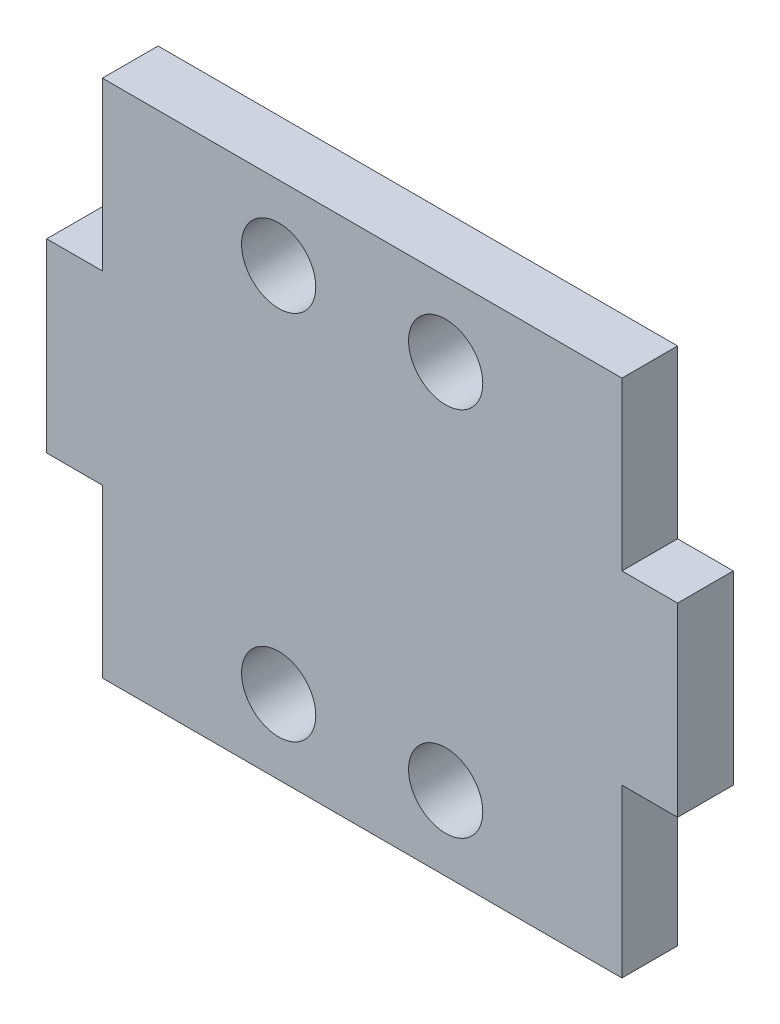
ISO-10303-21;
HEADER;
FILE_DESCRIPTION(('STEP AP214'),'2;1');
FILE_NAME('part.step','',(''),(''),'','','');
FILE_SCHEMA(('AUTOMOTIVE_DESIGN { 1 0 10303 214 1 1 1 1 }'));
ENDSEC;
DATA;
#1=APPLICATION_CONTEXT('core data for automotive mechanical design processes');
#2=APPLICATION_PROTOCOL_DEFINITION('international standard','automotive_design',2000,#1);
#3=PRODUCT_CONTEXT('',#1,'mechanical');
#4=PRODUCT('Part','Part','',(#3));
#5=PRODUCT_RELATED_PRODUCT_CATEGORY('part','',(#4));
#6=PRODUCT_DEFINITION_FORMATION('','',#4);
#7=PRODUCT_DEFINITION_CONTEXT('part definition',#1,'design');
#8=PRODUCT_DEFINITION('design','',#6,#7);
#9=PRODUCT_DEFINITION_SHAPE('','',#8);
#10=(LENGTH_UNIT() NAMED_UNIT(*) SI_UNIT(.MILLI.,.METRE.));
#11=(NAMED_UNIT(*) PLANE_ANGLE_UNIT() SI_UNIT($,.RADIAN.));
#12=(NAMED_UNIT(*) SI_UNIT($,.STERADIAN.) SOLID_ANGLE_UNIT());
#13=UNCERTAINTY_MEASURE_WITH_UNIT(LENGTH_MEASURE(1.E-05),#10,'distance_accuracy_value','');
#14=(GEOMETRIC_REPRESENTATION_CONTEXT(3) GLOBAL_UNCERTAINTY_ASSIGNED_CONTEXT((#13)) GLOBAL_UNIT_ASSIGNED_CONTEXT((#10,
#11,#12)) REPRESENTATION_CONTEXT('',''));
#15=CARTESIAN_POINT('',(0.,0.,0.));
#16=DIRECTION('',(0.,0.,1.));
#17=DIRECTION('',(1.,0.,0.));
#18=AXIS2_PLACEMENT_3D('',#15,#16,#17);
#19=CARTESIAN_POINT('',(0.,0.,3.));
#20=DIRECTION('',(0.,0.,-1.));
#21=DIRECTION('',(-1.,0.,0.));
#22=AXIS2_PLACEMENT_3D('',#19,#20,#21);
#23=PLANE('',#22);
#24=DIRECTION('',(0.,1.,0.));
#25=VECTOR('',#24,1.);
#26=CARTESIAN_POINT('',(-14.,5.,3.));
#27=LINE('',#26,#25);
#28=CARTESIAN_POINT('',(-14.,5.,3.));
#29=VERTEX_POINT('',#28);
#30=CARTESIAN_POINT('',(-14.,14.,3.));
#31=VERTEX_POINT('',#30);
#32=EDGE_CURVE('E342',#29,#31,#27,.T.);
#33=ORIENTED_EDGE('',*,*,#32,.F.);
#34=DIRECTION('',(-1.,0.,0.));
#35=VECTOR('',#34,1.);
#36=CARTESIAN_POINT('',(-14.,5.,3.));
#37=LINE('',#36,#35);
#38=CARTESIAN_POINT('',(-17.,5.,3.));
#39=VERTEX_POINT('',#38);
#40=EDGE_CURVE('E290',#29,#39,#37,.T.);
#41=ORIENTED_EDGE('',*,*,#40,.T.);
#42=DIRECTION('',(0.,-1.,0.));
#43=VECTOR('',#42,1.);
#44=CARTESIAN_POINT('',(-17.,5.,3.));
#45=LINE('',#44,#43);
#46=CARTESIAN_POINT('',(-17.,-5.,3.));
#47=VERTEX_POINT('',#46);
#48=EDGE_CURVE('E282',#39,#47,#45,.T.);
#49=ORIENTED_EDGE('',*,*,#48,.T.);
#50=DIRECTION('',(1.,0.,0.));
#51=VECTOR('',#50,1.);
#52=CARTESIAN_POINT('',(-17.,-5.,3.));
#53=LINE('',#52,#51);
#54=CARTESIAN_POINT('',(-14.,-5.,3.));
#55=VERTEX_POINT('',#54);
#56=EDGE_CURVE('E288',#47,#55,#53,.T.);
#57=ORIENTED_EDGE('',*,*,#56,.T.);
#58=DIRECTION('',(0.,1.,0.));
#59=VECTOR('',#58,1.);
#60=CARTESIAN_POINT('',(-14.,-14.,3.));
#61=LINE('',#60,#59);
#62=CARTESIAN_POINT('',(-14.,-14.,3.));
#63=VERTEX_POINT('',#62);
#64=EDGE_CURVE('E305',#63,#55,#61,.T.);
#65=ORIENTED_EDGE('',*,*,#64,.F.);
#66=DIRECTION('',(1.,0.,0.));
#67=VECTOR('',#66,1.);
#68=CARTESIAN_POINT('',(-14.,-14.,3.));
#69=LINE('',#68,#67);
#70=CARTESIAN_POINT('',(14.,-14.,3.));
#71=VERTEX_POINT('',#70);
#72=EDGE_CURVE('E307',#63,#71,#69,.T.);
#73=ORIENTED_EDGE('',*,*,#72,.T.);
#74=DIRECTION('',(0.,1.,0.));
#75=VECTOR('',#74,1.);
#76=CARTESIAN_POINT('',(14.,-14.,3.));
#77=LINE('',#76,#75);
#78=CARTESIAN_POINT('',(14.,-5.,3.));
#79=VERTEX_POINT('',#78);
#80=EDGE_CURVE('E374',#71,#79,#77,.T.);
#81=ORIENTED_EDGE('',*,*,#80,.T.);
#82=DIRECTION('',(-1.,0.,0.));
#83=VECTOR('',#82,1.);
#84=CARTESIAN_POINT('',(17.,-5.,3.));
#85=LINE('',#84,#83);
#86=CARTESIAN_POINT('',(17.,-5.,3.));
#87=VERTEX_POINT('',#86);
#88=EDGE_CURVE('E381',#87,#79,#85,.T.);
#89=ORIENTED_EDGE('',*,*,#88,.F.);
#90=DIRECTION('',(0.,-1.,0.));
#91=VECTOR('',#90,1.);
#92=CARTESIAN_POINT('',(17.,5.,3.));
#93=LINE('',#92,#91);
#94=CARTESIAN_POINT('',(17.,5.,3.));
#95=VERTEX_POINT('',#94);
#96=EDGE_CURVE('E383',#95,#87,#93,.T.);
#97=ORIENTED_EDGE('',*,*,#96,.F.);
#98=DIRECTION('',(1.,0.,0.));
#99=VECTOR('',#98,1.);
#100=CARTESIAN_POINT('',(14.,5.,3.));
#101=LINE('',#100,#99);
#102=CARTESIAN_POINT('',(14.,5.,3.));
#103=VERTEX_POINT('',#102);
#104=EDGE_CURVE('E388',#103,#95,#101,.T.);
#105=ORIENTED_EDGE('',*,*,#104,.F.);
#106=DIRECTION('',(0.,1.,0.));
#107=VECTOR('',#106,1.);
#108=CARTESIAN_POINT('',(14.,5.,3.));
#109=LINE('',#108,#107);
#110=CARTESIAN_POINT('',(14.,14.,3.));
#111=VERTEX_POINT('',#110);
#112=EDGE_CURVE('E391',#103,#111,#109,.T.);
#113=ORIENTED_EDGE('',*,*,#112,.T.);
#114=DIRECTION('',(1.,0.,0.));
#115=VECTOR('',#114,1.);
#116=CARTESIAN_POINT('',(-14.,14.,3.));
#117=LINE('',#116,#115);
#118=EDGE_CURVE('E393',#31,#111,#117,.T.);
#119=ORIENTED_EDGE('',*,*,#118,.F.);
#120=EDGE_LOOP('',(#33,#41,#49,#57,#65,#73,#81,#89,#97,#105,#113,#119));
#121=FACE_BOUND('',#120,.T.);
#122=CARTESIAN_POINT('',(-4.50000000000001,-10.,3.));
#123=DIRECTION('',(0.,0.,1.));
#124=DIRECTION('',(1.,0.,0.));
#125=AXIS2_PLACEMENT_3D('',#122,#123,#124);
#126=CIRCLE('',#125,2.);
#127=CARTESIAN_POINT('',(-2.50000000000001,-10.,3.));
#128=VERTEX_POINT('',#127);
#129=EDGE_CURVE('E316',#128,#128,#126,.T.);
#130=ORIENTED_EDGE('',*,*,#129,.F.);
#131=EDGE_LOOP('',(#130));
#132=FACE_BOUND('',#131,.T.);
#133=CARTESIAN_POINT('',(4.50000000000001,-10.,3.));
#134=DIRECTION('',(0.,0.,1.));
#135=DIRECTION('',(1.,0.,0.));
#136=AXIS2_PLACEMENT_3D('',#133,#134,#135);
#137=CIRCLE('',#136,2.);
#138=CARTESIAN_POINT('',(6.50000000000001,-10.,3.));
#139=VERTEX_POINT('',#138);
#140=EDGE_CURVE('E399',#139,#139,#137,.T.);
#141=ORIENTED_EDGE('',*,*,#140,.F.);
#142=EDGE_LOOP('',(#141));
#143=FACE_BOUND('',#142,.T.);
#144=CARTESIAN_POINT('',(4.50000000000001,10.,3.));
#145=DIRECTION('',(0.,0.,1.));
#146=DIRECTION('',(1.,0.,0.));
#147=AXIS2_PLACEMENT_3D('',#144,#145,#146);
#148=CIRCLE('',#147,2.);
#149=CARTESIAN_POINT('',(6.50000000000001,10.,3.));
#150=VERTEX_POINT('',#149);
#151=EDGE_CURVE('E405',#150,#150,#148,.T.);
#152=ORIENTED_EDGE('',*,*,#151,.F.);
#153=EDGE_LOOP('',(#152));
#154=FACE_BOUND('',#153,.T.);
#155=CARTESIAN_POINT('',(-4.50000000000001,10.,3.));
#156=DIRECTION('',(0.,0.,1.));
#157=DIRECTION('',(1.,0.,0.));
#158=AXIS2_PLACEMENT_3D('',#155,#156,#157);
#159=CIRCLE('',#158,2.);
#160=CARTESIAN_POINT('',(-2.5,10.,3.));
#161=VERTEX_POINT('',#160);
#162=EDGE_CURVE('E411',#161,#161,#159,.T.);
#163=ORIENTED_EDGE('',*,*,#162,.F.);
#164=EDGE_LOOP('',(#163));
#165=FACE_BOUND('',#164,.T.);
#166=ADVANCED_FACE('F188',(#121,#132,#143,#154,#165),#23,.F.);
#167=CARTESIAN_POINT('',(0.,0.,0.));
#168=DIRECTION('',(0.,0.,-1.));
#169=DIRECTION('',(-1.,0.,0.));
#170=AXIS2_PLACEMENT_3D('',#167,#168,#169);
#171=PLANE('',#170);
#172=CARTESIAN_POINT('',(4.50000000000001,10.,0.));
#173=DIRECTION('',(0.,0.,1.));
#174=DIRECTION('',(1.,0.,0.));
#175=AXIS2_PLACEMENT_3D('',#172,#173,#174);
#176=CIRCLE('',#175,2.);
#177=CARTESIAN_POINT('',(6.50000000000001,10.,0.));
#178=VERTEX_POINT('',#177);
#179=EDGE_CURVE('E408',#178,#178,#176,.T.);
#180=ORIENTED_EDGE('',*,*,#179,.T.);
#181=EDGE_LOOP('',(#180));
#182=FACE_BOUND('',#181,.T.);
#183=CARTESIAN_POINT('',(-4.50000000000001,-10.,0.));
#184=DIRECTION('',(0.,0.,1.));
#185=DIRECTION('',(1.,0.,0.));
#186=AXIS2_PLACEMENT_3D('',#183,#184,#185);
#187=CIRCLE('',#186,2.);
#188=CARTESIAN_POINT('',(-2.50000000000001,-10.,0.));
#189=VERTEX_POINT('',#188);
#190=EDGE_CURVE('E396',#189,#189,#187,.T.);
#191=ORIENTED_EDGE('',*,*,#190,.T.);
#192=EDGE_LOOP('',(#191));
#193=FACE_BOUND('',#192,.T.);
#194=DIRECTION('',(0.,1.,0.));
#195=VECTOR('',#194,1.);
#196=CARTESIAN_POINT('',(-14.,5.,0.));
#197=LINE('',#196,#195);
#198=CARTESIAN_POINT('',(-14.,5.,0.));
#199=VERTEX_POINT('',#198);
#200=CARTESIAN_POINT('',(-14.,14.,0.));
#201=VERTEX_POINT('',#200);
#202=EDGE_CURVE('E312',#199,#201,#197,.T.);
#203=ORIENTED_EDGE('',*,*,#202,.T.);
#204=DIRECTION('',(1.,0.,0.));
#205=VECTOR('',#204,1.);
#206=CARTESIAN_POINT('',(-14.,14.,0.));
#207=LINE('',#206,#205);
#208=CARTESIAN_POINT('',(14.,14.,0.));
#209=VERTEX_POINT('',#208);
#210=EDGE_CURVE('E315',#201,#209,#207,.T.);
#211=ORIENTED_EDGE('',*,*,#210,.T.);
#212=DIRECTION('',(0.,1.,0.));
#213=VECTOR('',#212,1.);
#214=CARTESIAN_POINT('',(14.,5.,0.));
#215=LINE('',#214,#213);
#216=CARTESIAN_POINT('',(14.,5.,0.));
#217=VERTEX_POINT('',#216);
#218=EDGE_CURVE('E319',#217,#209,#215,.T.);
#219=ORIENTED_EDGE('',*,*,#218,.F.);
#220=DIRECTION('',(1.,0.,0.));
#221=VECTOR('',#220,1.);
#222=CARTESIAN_POINT('',(14.,5.,0.));
#223=LINE('',#222,#221);
#224=CARTESIAN_POINT('',(17.,5.,0.));
#225=VERTEX_POINT('',#224);
#226=EDGE_CURVE('E322',#217,#225,#223,.T.);
#227=ORIENTED_EDGE('',*,*,#226,.T.);
#228=DIRECTION('',(0.,-1.,0.));
#229=VECTOR('',#228,1.);
#230=CARTESIAN_POINT('',(17.,5.,0.));
#231=LINE('',#230,#229);
#232=CARTESIAN_POINT('',(17.,-5.,0.));
#233=VERTEX_POINT('',#232);
#234=EDGE_CURVE('E325',#225,#233,#231,.T.);
#235=ORIENTED_EDGE('',*,*,#234,.T.);
#236=DIRECTION('',(-1.,0.,0.));
#237=VECTOR('',#236,1.);
#238=CARTESIAN_POINT('',(17.,-5.,0.));
#239=LINE('',#238,#237);
#240=CARTESIAN_POINT('',(14.,-5.,0.));
#241=VERTEX_POINT('',#240);
#242=EDGE_CURVE('E328',#233,#241,#239,.T.);
#243=ORIENTED_EDGE('',*,*,#242,.T.);
#244=DIRECTION('',(0.,1.,0.));
#245=VECTOR('',#244,1.);
#246=CARTESIAN_POINT('',(14.,-14.,0.));
#247=LINE('',#246,#245);
#248=CARTESIAN_POINT('',(14.,-14.,0.));
#249=VERTEX_POINT('',#248);
#250=EDGE_CURVE('E331',#249,#241,#247,.T.);
#251=ORIENTED_EDGE('',*,*,#250,.F.);
#252=DIRECTION('',(1.,0.,0.));
#253=VECTOR('',#252,1.);
#254=CARTESIAN_POINT('',(-14.,-14.,0.));
#255=LINE('',#254,#253);
#256=CARTESIAN_POINT('',(-14.,-14.,0.));
#257=VERTEX_POINT('',#256);
#258=EDGE_CURVE('E334',#257,#249,#255,.T.);
#259=ORIENTED_EDGE('',*,*,#258,.F.);
#260=DIRECTION('',(0.,1.,0.));
#261=VECTOR('',#260,1.);
#262=CARTESIAN_POINT('',(-14.,-14.,0.));
#263=LINE('',#262,#261);
#264=CARTESIAN_POINT('',(-14.,-5.,0.));
#265=VERTEX_POINT('',#264);
#266=EDGE_CURVE('E336',#257,#265,#263,.T.);
#267=ORIENTED_EDGE('',*,*,#266,.T.);
#268=DIRECTION('',(1.,0.,0.));
#269=VECTOR('',#268,1.);
#270=CARTESIAN_POINT('',(-17.,-5.,0.));
#271=LINE('',#270,#269);
#272=CARTESIAN_POINT('',(-17.,-5.,0.));
#273=VERTEX_POINT('',#272);
#274=EDGE_CURVE('E339',#273,#265,#271,.T.);
#275=ORIENTED_EDGE('',*,*,#274,.F.);
#276=DIRECTION('',(0.,-1.,0.));
#277=VECTOR('',#276,1.);
#278=CARTESIAN_POINT('',(-17.,5.,0.));
#279=LINE('',#278,#277);
#280=CARTESIAN_POINT('',(-17.,5.,0.));
#281=VERTEX_POINT('',#280);
#282=EDGE_CURVE('E297',#281,#273,#279,.T.);
#283=ORIENTED_EDGE('',*,*,#282,.F.);
#284=DIRECTION('',(-1.,0.,0.));
#285=VECTOR('',#284,1.);
#286=CARTESIAN_POINT('',(-14.,5.,0.));
#287=LINE('',#286,#285);
#288=EDGE_CURVE('E246',#199,#281,#287,.T.);
#289=ORIENTED_EDGE('',*,*,#288,.F.);
#290=EDGE_LOOP('',(#203,#211,#219,#227,#235,#243,#251,#259,#267,#275,#283,#289));
#291=FACE_BOUND('',#290,.T.);
#292=CARTESIAN_POINT('',(4.50000000000001,-10.,0.));
#293=DIRECTION('',(0.,0.,1.));
#294=DIRECTION('',(1.,0.,0.));
#295=AXIS2_PLACEMENT_3D('',#292,#293,#294);
#296=CIRCLE('',#295,2.);
#297=CARTESIAN_POINT('',(6.50000000000001,-10.,0.));
#298=VERTEX_POINT('',#297);
#299=EDGE_CURVE('E402',#298,#298,#296,.T.);
#300=ORIENTED_EDGE('',*,*,#299,.T.);
#301=EDGE_LOOP('',(#300));
#302=FACE_BOUND('',#301,.T.);
#303=CARTESIAN_POINT('',(-4.50000000000001,10.,0.));
#304=DIRECTION('',(0.,0.,1.));
#305=DIRECTION('',(1.,0.,0.));
#306=AXIS2_PLACEMENT_3D('',#303,#304,#305);
#307=CIRCLE('',#306,2.);
#308=CARTESIAN_POINT('',(-2.5,10.,0.));
#309=VERTEX_POINT('',#308);
#310=EDGE_CURVE('E414',#309,#309,#307,.T.);
#311=ORIENTED_EDGE('',*,*,#310,.T.);
#312=EDGE_LOOP('',(#311));
#313=FACE_BOUND('',#312,.T.);
#314=ADVANCED_FACE('F363',(#182,#193,#291,#302,#313),#171,.T.);
#315=CARTESIAN_POINT('',(-14.,5.,3.));
#316=DIRECTION('',(-1.,0.,0.));
#317=DIRECTION('',(0.,-1.,0.));
#318=AXIS2_PLACEMENT_3D('',#315,#316,#317);
#319=PLANE('',#318);
#320=ORIENTED_EDGE('',*,*,#202,.F.);
#321=DIRECTION('',(0.,0.,-1.));
#322=VECTOR('',#321,1.);
#323=CARTESIAN_POINT('',(-14.,5.,3.));
#324=LINE('',#323,#322);
#325=EDGE_CURVE('E12',#29,#199,#324,.T.);
#326=ORIENTED_EDGE('',*,*,#325,.F.);
#327=ORIENTED_EDGE('',*,*,#32,.T.);
#328=DIRECTION('',(0.,0.,-1.));
#329=VECTOR('',#328,1.);
#330=CARTESIAN_POINT('',(-14.,14.,3.));
#331=LINE('',#330,#329);
#332=EDGE_CURVE('E192',#31,#201,#331,.T.);
#333=ORIENTED_EDGE('',*,*,#332,.T.);
#334=EDGE_LOOP('',(#320,#326,#327,#333));
#335=FACE_BOUND('',#334,.T.);
#336=ADVANCED_FACE('F190',(#335),#319,.T.);
#337=CARTESIAN_POINT('',(-14.,5.,3.));
#338=DIRECTION('',(0.,-1.,0.));
#339=DIRECTION('',(0.,0.,-1.));
#340=AXIS2_PLACEMENT_3D('',#337,#338,#339);
#341=PLANE('',#340);
#342=ORIENTED_EDGE('',*,*,#288,.T.);
#343=DIRECTION('',(0.,0.,-1.));
#344=VECTOR('',#343,1.);
#345=CARTESIAN_POINT('',(-17.,5.,3.));
#346=LINE('',#345,#344);
#347=EDGE_CURVE('E198',#39,#281,#346,.T.);
#348=ORIENTED_EDGE('',*,*,#347,.F.);
#349=ORIENTED_EDGE('',*,*,#40,.F.);
#350=ORIENTED_EDGE('',*,*,#325,.T.);
#351=EDGE_LOOP('',(#342,#348,#349,#350));
#352=FACE_BOUND('',#351,.T.);
#353=ADVANCED_FACE('F434',(#352),#341,.F.);
#354=CARTESIAN_POINT('',(-17.,5.,3.));
#355=DIRECTION('',(1.,0.,0.));
#356=DIRECTION('',(0.,0.,-1.));
#357=AXIS2_PLACEMENT_3D('',#354,#355,#356);
#358=PLANE('',#357);
#359=ORIENTED_EDGE('',*,*,#282,.T.);
#360=DIRECTION('',(0.,0.,-1.));
#361=VECTOR('',#360,1.);
#362=CARTESIAN_POINT('',(-17.,-5.,3.));
#363=LINE('',#362,#361);
#364=EDGE_CURVE('E294',#47,#273,#363,.T.);
#365=ORIENTED_EDGE('',*,*,#364,.F.);
#366=ORIENTED_EDGE('',*,*,#48,.F.);
#367=ORIENTED_EDGE('',*,*,#347,.T.);
#368=EDGE_LOOP('',(#359,#365,#366,#367));
#369=FACE_BOUND('',#368,.T.);
#370=ADVANCED_FACE('F295',(#369),#358,.F.);
#371=CARTESIAN_POINT('',(-17.,-5.,3.));
#372=DIRECTION('',(0.,1.,0.));
#373=DIRECTION('',(0.,0.,1.));
#374=AXIS2_PLACEMENT_3D('',#371,#372,#373);
#375=PLANE('',#374);
#376=ORIENTED_EDGE('',*,*,#274,.T.);
#377=DIRECTION('',(0.,0.,-1.));
#378=VECTOR('',#377,1.);
#379=CARTESIAN_POINT('',(-14.,-5.,3.));
#380=LINE('',#379,#378);
#381=EDGE_CURVE('E301',#55,#265,#380,.T.);
#382=ORIENTED_EDGE('',*,*,#381,.F.);
#383=ORIENTED_EDGE('',*,*,#56,.F.);
#384=ORIENTED_EDGE('',*,*,#364,.T.);
#385=EDGE_LOOP('',(#376,#382,#383,#384));
#386=FACE_BOUND('',#385,.T.);
#387=ADVANCED_FACE('F303',(#386),#375,.F.);
#388=CARTESIAN_POINT('',(-14.,-14.,3.));
#389=DIRECTION('',(-1.,0.,0.));
#390=DIRECTION('',(0.,-1.,0.));
#391=AXIS2_PLACEMENT_3D('',#388,#389,#390);
#392=PLANE('',#391);
#393=ORIENTED_EDGE('',*,*,#266,.F.);
#394=DIRECTION('',(0.,0.,-1.));
#395=VECTOR('',#394,1.);
#396=CARTESIAN_POINT('',(-14.,-14.,3.));
#397=LINE('',#396,#395);
#398=EDGE_CURVE('E346',#63,#257,#397,.T.);
#399=ORIENTED_EDGE('',*,*,#398,.F.);
#400=ORIENTED_EDGE('',*,*,#64,.T.);
#401=ORIENTED_EDGE('',*,*,#381,.T.);
#402=EDGE_LOOP('',(#393,#399,#400,#401));
#403=FACE_BOUND('',#402,.T.);
#404=ADVANCED_FACE('F369',(#403),#392,.T.);
#405=CARTESIAN_POINT('',(-14.,-14.,3.));
#406=DIRECTION('',(0.,1.,0.));
#407=DIRECTION('',(-1.,0.,0.));
#408=AXIS2_PLACEMENT_3D('',#405,#406,#407);
#409=PLANE('',#408);
#410=ORIENTED_EDGE('',*,*,#258,.T.);
#411=DIRECTION('',(0.,0.,-1.));
#412=VECTOR('',#411,1.);
#413=CARTESIAN_POINT('',(14.,-14.,3.));
#414=LINE('',#413,#412);
#415=EDGE_CURVE('E348',#71,#249,#414,.T.);
#416=ORIENTED_EDGE('',*,*,#415,.F.);
#417=ORIENTED_EDGE('',*,*,#72,.F.);
#418=ORIENTED_EDGE('',*,*,#398,.T.);
#419=EDGE_LOOP('',(#410,#416,#417,#418));
#420=FACE_BOUND('',#419,.T.);
#421=ADVANCED_FACE('F377',(#420),#409,.F.);
#422=CARTESIAN_POINT('',(14.,-14.,3.));
#423=DIRECTION('',(-1.,0.,0.));
#424=DIRECTION('',(0.,-1.,0.));
#425=AXIS2_PLACEMENT_3D('',#422,#423,#424);
#426=PLANE('',#425);
#427=ORIENTED_EDGE('',*,*,#250,.T.);
#428=DIRECTION('',(0.,0.,-1.));
#429=VECTOR('',#428,1.);
#430=CARTESIAN_POINT('',(14.,-5.,3.));
#431=LINE('',#430,#429);
#432=EDGE_CURVE('E351',#79,#241,#431,.T.);
#433=ORIENTED_EDGE('',*,*,#432,.F.);
#434=ORIENTED_EDGE('',*,*,#80,.F.);
#435=ORIENTED_EDGE('',*,*,#415,.T.);
#436=EDGE_LOOP('',(#427,#433,#434,#435));
#437=FACE_BOUND('',#436,.T.);
#438=ADVANCED_FACE('F379',(#437),#426,.F.);
#439=CARTESIAN_POINT('',(17.,-5.,3.));
#440=DIRECTION('',(0.,-1.,0.));
#441=DIRECTION('',(1.,0.,0.));
#442=AXIS2_PLACEMENT_3D('',#439,#440,#441);
#443=PLANE('',#442);
#444=ORIENTED_EDGE('',*,*,#242,.F.);
#445=DIRECTION('',(0.,0.,-1.));
#446=VECTOR('',#445,1.);
#447=CARTESIAN_POINT('',(17.,-5.,3.));
#448=LINE('',#447,#446);
#449=EDGE_CURVE('E353',#87,#233,#448,.T.);
#450=ORIENTED_EDGE('',*,*,#449,.F.);
#451=ORIENTED_EDGE('',*,*,#88,.T.);
#452=ORIENTED_EDGE('',*,*,#432,.T.);
#453=EDGE_LOOP('',(#444,#450,#451,#452));
#454=FACE_BOUND('',#453,.T.);
#455=ADVANCED_FACE('F447',(#454),#443,.T.);
#456=CARTESIAN_POINT('',(17.,5.,3.));
#457=DIRECTION('',(1.,0.,0.));
#458=DIRECTION('',(0.,0.,-1.));
#459=AXIS2_PLACEMENT_3D('',#456,#457,#458);
#460=PLANE('',#459);
#461=ORIENTED_EDGE('',*,*,#234,.F.);
#462=DIRECTION('',(0.,0.,-1.));
#463=VECTOR('',#462,1.);
#464=CARTESIAN_POINT('',(17.,5.,3.));
#465=LINE('',#464,#463);
#466=EDGE_CURVE('E355',#95,#225,#465,.T.);
#467=ORIENTED_EDGE('',*,*,#466,.F.);
#468=ORIENTED_EDGE('',*,*,#96,.T.);
#469=ORIENTED_EDGE('',*,*,#449,.T.);
#470=EDGE_LOOP('',(#461,#467,#468,#469));
#471=FACE_BOUND('',#470,.T.);
#472=ADVANCED_FACE('F450',(#471),#460,.T.);
#473=CARTESIAN_POINT('',(14.,5.,3.));
#474=DIRECTION('',(0.,1.,0.));
#475=DIRECTION('',(-1.,0.,0.));
#476=AXIS2_PLACEMENT_3D('',#473,#474,#475);
#477=PLANE('',#476);
#478=ORIENTED_EDGE('',*,*,#226,.F.);
#479=DIRECTION('',(0.,0.,-1.));
#480=VECTOR('',#479,1.);
#481=CARTESIAN_POINT('',(14.,5.,3.));
#482=LINE('',#481,#480);
#483=EDGE_CURVE('E357',#103,#217,#482,.T.);
#484=ORIENTED_EDGE('',*,*,#483,.F.);
#485=ORIENTED_EDGE('',*,*,#104,.T.);
#486=ORIENTED_EDGE('',*,*,#466,.T.);
#487=EDGE_LOOP('',(#478,#484,#485,#486));
#488=FACE_BOUND('',#487,.T.);
#489=ADVANCED_FACE('F454',(#488),#477,.T.);
#490=CARTESIAN_POINT('',(14.,5.,3.));
#491=DIRECTION('',(-1.,0.,0.));
#492=DIRECTION('',(0.,-1.,0.));
#493=AXIS2_PLACEMENT_3D('',#490,#491,#492);
#494=PLANE('',#493);
#495=ORIENTED_EDGE('',*,*,#218,.T.);
#496=DIRECTION('',(0.,0.,-1.));
#497=VECTOR('',#496,1.);
#498=CARTESIAN_POINT('',(14.,14.,3.));
#499=LINE('',#498,#497);
#500=EDGE_CURVE('E358',#111,#209,#499,.T.);
#501=ORIENTED_EDGE('',*,*,#500,.F.);
#502=ORIENTED_EDGE('',*,*,#112,.F.);
#503=ORIENTED_EDGE('',*,*,#483,.T.);
#504=EDGE_LOOP('',(#495,#501,#502,#503));
#505=FACE_BOUND('',#504,.T.);
#506=ADVANCED_FACE('F458',(#505),#494,.F.);
#507=CARTESIAN_POINT('',(-14.,14.,3.));
#508=DIRECTION('',(0.,1.,0.));
#509=DIRECTION('',(-1.,0.,0.));
#510=AXIS2_PLACEMENT_3D('',#507,#508,#509);
#511=PLANE('',#510);
#512=ORIENTED_EDGE('',*,*,#210,.F.);
#513=ORIENTED_EDGE('',*,*,#332,.F.);
#514=ORIENTED_EDGE('',*,*,#118,.T.);
#515=ORIENTED_EDGE('',*,*,#500,.T.);
#516=EDGE_LOOP('',(#512,#513,#514,#515));
#517=FACE_BOUND('',#516,.T.);
#518=ADVANCED_FACE('F360',(#517),#511,.T.);
#519=CARTESIAN_POINT('',(-4.50000000000001,-10.,3.));
#520=DIRECTION('',(0.,0.,-1.));
#521=DIRECTION('',(-1.,0.,0.));
#522=AXIS2_PLACEMENT_3D('',#519,#520,#521);
#523=CYLINDRICAL_SURFACE('',#522,2.);
#524=ORIENTED_EDGE('',*,*,#129,.T.);
#525=EDGE_LOOP('',(#524));
#526=FACE_BOUND('',#525,.T.);
#527=ORIENTED_EDGE('',*,*,#190,.F.);
#528=EDGE_LOOP('',(#527));
#529=FACE_BOUND('',#528,.T.);
#530=ADVANCED_FACE('F431',(#526,#529),#523,.F.);
#531=CARTESIAN_POINT('',(4.50000000000001,-10.,3.));
#532=DIRECTION('',(0.,0.,-1.));
#533=DIRECTION('',(-1.,0.,0.));
#534=AXIS2_PLACEMENT_3D('',#531,#532,#533);
#535=CYLINDRICAL_SURFACE('',#534,2.);
#536=ORIENTED_EDGE('',*,*,#140,.T.);
#537=EDGE_LOOP('',(#536));
#538=FACE_BOUND('',#537,.T.);
#539=ORIENTED_EDGE('',*,*,#299,.F.);
#540=EDGE_LOOP('',(#539));
#541=FACE_BOUND('',#540,.T.);
#542=ADVANCED_FACE('F466',(#538,#541),#535,.F.);
#543=CARTESIAN_POINT('',(4.50000000000001,10.,3.));
#544=DIRECTION('',(0.,0.,-1.));
#545=DIRECTION('',(-1.,0.,0.));
#546=AXIS2_PLACEMENT_3D('',#543,#544,#545);
#547=CYLINDRICAL_SURFACE('',#546,2.);
#548=ORIENTED_EDGE('',*,*,#151,.T.);
#549=EDGE_LOOP('',(#548));
#550=FACE_BOUND('',#549,.T.);
#551=ORIENTED_EDGE('',*,*,#179,.F.);
#552=EDGE_LOOP('',(#551));
#553=FACE_BOUND('',#552,.T.);
#554=ADVANCED_FACE('F471',(#550,#553),#547,.F.);
#555=CARTESIAN_POINT('',(-4.50000000000001,10.,3.));
#556=DIRECTION('',(0.,0.,-1.));
#557=DIRECTION('',(-1.,0.,0.));
#558=AXIS2_PLACEMENT_3D('',#555,#556,#557);
#559=CYLINDRICAL_SURFACE('',#558,2.);
#560=ORIENTED_EDGE('',*,*,#162,.T.);
#561=EDGE_LOOP('',(#560));
#562=FACE_BOUND('',#561,.T.);
#563=ORIENTED_EDGE('',*,*,#310,.F.);
#564=EDGE_LOOP('',(#563));
#565=FACE_BOUND('',#564,.T.);
#566=ADVANCED_FACE('F420',(#562,#565),#559,.F.);
#567=CLOSED_SHELL('',(#166,#314,#336,#353,#370,#387,#404,#421,#438,#455,#472,#489,#506,#518,
#530,#542,#554,#566));
#568=MANIFOLD_SOLID_BREP('B2',#567);
#569=ADVANCED_BREP_SHAPE_REPRESENTATION('',(#18,#568),#14);
#570=SHAPE_DEFINITION_REPRESENTATION(#9,#569);
ENDSEC;
END-ISO-10303-21;
